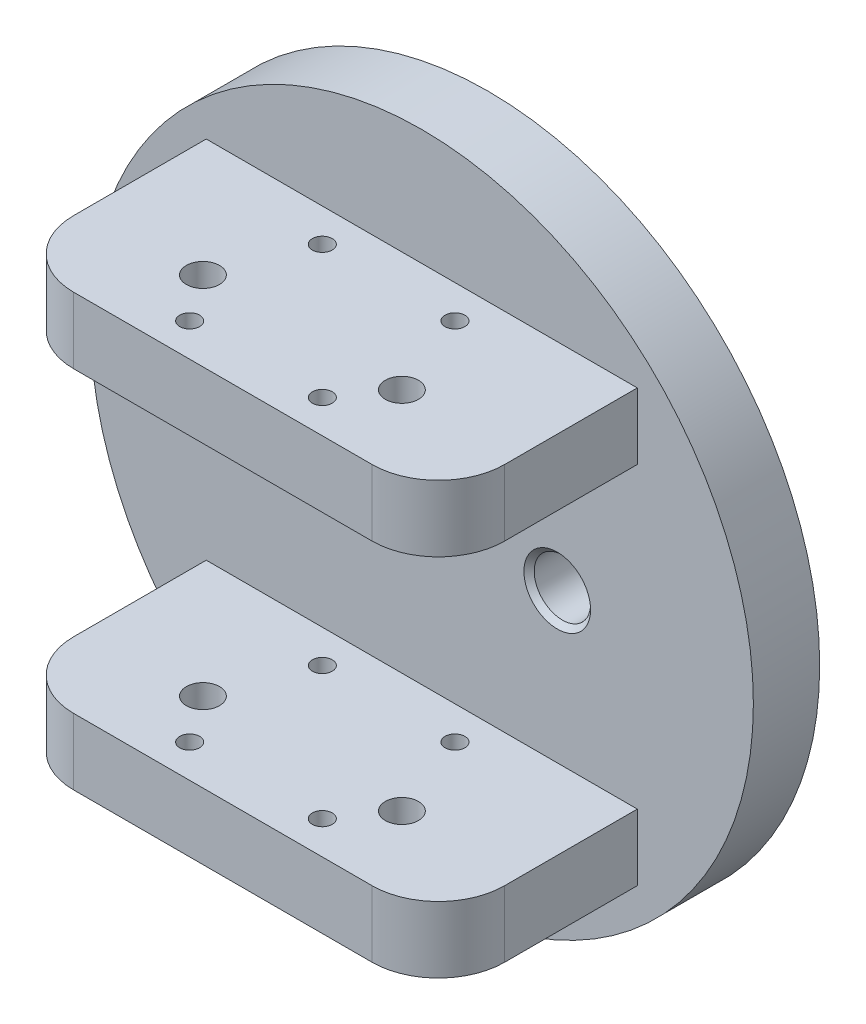
ISO-10303-21;
HEADER;
FILE_DESCRIPTION(('STEP AP214'),'2;1');
FILE_NAME('part.step','',(''),(''),'','','');
FILE_SCHEMA(('AUTOMOTIVE_DESIGN { 1 0 10303 214 1 1 1 1 }'));
ENDSEC;
DATA;
#1=APPLICATION_CONTEXT('core data for automotive mechanical design processes');
#2=APPLICATION_PROTOCOL_DEFINITION('international standard','automotive_design',2000,#1);
#3=PRODUCT_CONTEXT('',#1,'mechanical');
#4=PRODUCT('Part','Part','',(#3));
#5=PRODUCT_RELATED_PRODUCT_CATEGORY('part','',(#4));
#6=PRODUCT_DEFINITION_FORMATION('','',#4);
#7=PRODUCT_DEFINITION_CONTEXT('part definition',#1,'design');
#8=PRODUCT_DEFINITION('design','',#6,#7);
#9=PRODUCT_DEFINITION_SHAPE('','',#8);
#10=(LENGTH_UNIT() NAMED_UNIT(*) SI_UNIT(.MILLI.,.METRE.));
#11=(NAMED_UNIT(*) PLANE_ANGLE_UNIT() SI_UNIT($,.RADIAN.));
#12=(NAMED_UNIT(*) SI_UNIT($,.STERADIAN.) SOLID_ANGLE_UNIT());
#13=UNCERTAINTY_MEASURE_WITH_UNIT(LENGTH_MEASURE(1.E-05),#10,'distance_accuracy_value','');
#14=(GEOMETRIC_REPRESENTATION_CONTEXT(3) GLOBAL_UNCERTAINTY_ASSIGNED_CONTEXT((#13)) GLOBAL_UNIT_ASSIGNED_CONTEXT((#10,
#11,#12)) REPRESENTATION_CONTEXT('',''));
#15=CARTESIAN_POINT('',(0.,0.,0.));
#16=DIRECTION('',(0.,0.,1.));
#17=DIRECTION('',(1.,0.,0.));
#18=AXIS2_PLACEMENT_3D('',#15,#16,#17);
#19=CARTESIAN_POINT('',(-32.5,-22.5,40.));
#20=DIRECTION('',(0.,-1.,0.));
#21=DIRECTION('',(0.,0.,-1.));
#22=AXIS2_PLACEMENT_3D('',#19,#20,#21);
#23=PLANE('',#22);
#24=CARTESIAN_POINT('',(-15.,-22.5,28.));
#25=DIRECTION('',(0.,-1.,0.));
#26=DIRECTION('',(0.,0.,-1.));
#27=AXIS2_PLACEMENT_3D('',#24,#25,#26);
#28=CIRCLE('',#27,2.5);
#29=CARTESIAN_POINT('',(-15.,-22.5,25.5));
#30=VERTEX_POINT('',#29);
#31=EDGE_CURVE('E150',#30,#30,#28,.T.);
#32=ORIENTED_EDGE('',*,*,#31,.T.);
#33=EDGE_LOOP('',(#32));
#34=FACE_BOUND('',#33,.T.);
#35=CARTESIAN_POINT('',(-10.,-22.5,35.));
#36=DIRECTION('',(0.,-1.,0.));
#37=DIRECTION('',(0.,0.,-1.));
#38=AXIS2_PLACEMENT_3D('',#35,#36,#37);
#39=CIRCLE('',#38,1.5);
#40=CARTESIAN_POINT('',(-10.,-22.5,33.5));
#41=VERTEX_POINT('',#40);
#42=EDGE_CURVE('E404',#41,#41,#39,.T.);
#43=ORIENTED_EDGE('',*,*,#42,.T.);
#44=EDGE_LOOP('',(#43));
#45=FACE_BOUND('',#44,.T.);
#46=CARTESIAN_POINT('',(-10.,-22.5,15.));
#47=DIRECTION('',(0.,-1.,0.));
#48=DIRECTION('',(0.,0.,-1.));
#49=AXIS2_PLACEMENT_3D('',#46,#47,#48);
#50=CIRCLE('',#49,1.5);
#51=CARTESIAN_POINT('',(-10.,-22.5,13.5));
#52=VERTEX_POINT('',#51);
#53=EDGE_CURVE('E364',#52,#52,#50,.T.);
#54=ORIENTED_EDGE('',*,*,#53,.T.);
#55=EDGE_LOOP('',(#54));
#56=FACE_BOUND('',#55,.T.);
#57=DIRECTION('',(-1.,0.,0.));
#58=VECTOR('',#57,1.);
#59=CARTESIAN_POINT('',(-32.5,-22.5,40.));
#60=LINE('',#59,#58);
#61=CARTESIAN_POINT('',(22.5,-22.5,40.));
#62=VERTEX_POINT('',#61);
#63=CARTESIAN_POINT('',(-22.5,-22.5,40.));
#64=VERTEX_POINT('',#63);
#65=EDGE_CURVE('E167',#62,#64,#60,.T.);
#66=ORIENTED_EDGE('',*,*,#65,.F.);
#67=CARTESIAN_POINT('',(22.5,-22.5,30.));
#68=DIRECTION('',(0.,-1.,0.));
#69=DIRECTION('',(0.,0.,-1.));
#70=AXIS2_PLACEMENT_3D('',#67,#68,#69);
#71=CIRCLE('',#70,10.);
#72=CARTESIAN_POINT('',(32.5,-22.5,30.));
#73=VERTEX_POINT('',#72);
#74=EDGE_CURVE('E241',#62,#73,#71,.F.);
#75=ORIENTED_EDGE('',*,*,#74,.T.);
#76=DIRECTION('',(0.,0.,-1.));
#77=VECTOR('',#76,1.);
#78=CARTESIAN_POINT('',(32.5,-22.5,40.));
#79=LINE('',#78,#77);
#80=CARTESIAN_POINT('',(32.5,-22.5,10.));
#81=VERTEX_POINT('',#80);
#82=EDGE_CURVE('E190',#73,#81,#79,.T.);
#83=ORIENTED_EDGE('',*,*,#82,.T.);
#84=DIRECTION('',(-1.,0.,0.));
#85=VECTOR('',#84,1.);
#86=CARTESIAN_POINT('',(-32.5,-22.5,10.));
#87=LINE('',#86,#85);
#88=CARTESIAN_POINT('',(-32.5,-22.5,10.));
#89=VERTEX_POINT('',#88);
#90=EDGE_CURVE('E177',#81,#89,#87,.T.);
#91=ORIENTED_EDGE('',*,*,#90,.T.);
#92=DIRECTION('',(0.,0.,-1.));
#93=VECTOR('',#92,1.);
#94=CARTESIAN_POINT('',(-32.5,-22.5,40.));
#95=LINE('',#94,#93);
#96=CARTESIAN_POINT('',(-32.5,-22.5,30.));
#97=VERTEX_POINT('',#96);
#98=EDGE_CURVE('E188',#97,#89,#95,.T.);
#99=ORIENTED_EDGE('',*,*,#98,.F.);
#100=CARTESIAN_POINT('',(-22.5,-22.5,30.));
#101=DIRECTION('',(0.,-1.,0.));
#102=DIRECTION('',(0.,0.,-1.));
#103=AXIS2_PLACEMENT_3D('',#100,#101,#102);
#104=CIRCLE('',#103,10.);
#105=EDGE_CURVE('E239',#97,#64,#104,.F.);
#106=ORIENTED_EDGE('',*,*,#105,.T.);
#107=EDGE_LOOP('',(#66,#75,#83,#91,#99,#106));
#108=FACE_BOUND('',#107,.T.);
#109=CARTESIAN_POINT('',(10.,-22.5,35.));
#110=DIRECTION('',(0.,-1.,0.));
#111=DIRECTION('',(0.,0.,-1.));
#112=AXIS2_PLACEMENT_3D('',#109,#110,#111);
#113=CIRCLE('',#112,1.5);
#114=CARTESIAN_POINT('',(10.,-22.5,33.5));
#115=VERTEX_POINT('',#114);
#116=EDGE_CURVE('E377',#115,#115,#113,.F.);
#117=ORIENTED_EDGE('',*,*,#116,.F.);
#118=EDGE_LOOP('',(#117));
#119=FACE_BOUND('',#118,.T.);
#120=CARTESIAN_POINT('',(15.,-22.5,28.));
#121=DIRECTION('',(0.,-1.,0.));
#122=DIRECTION('',(0.,0.,-1.));
#123=AXIS2_PLACEMENT_3D('',#120,#121,#122);
#124=CIRCLE('',#123,2.5);
#125=CARTESIAN_POINT('',(15.,-22.5,25.5));
#126=VERTEX_POINT('',#125);
#127=EDGE_CURVE('E386',#126,#126,#124,.F.);
#128=ORIENTED_EDGE('',*,*,#127,.F.);
#129=EDGE_LOOP('',(#128));
#130=FACE_BOUND('',#129,.T.);
#131=CARTESIAN_POINT('',(10.,-22.5,15.));
#132=DIRECTION('',(0.,-1.,0.));
#133=DIRECTION('',(0.,0.,-1.));
#134=AXIS2_PLACEMENT_3D('',#131,#132,#133);
#135=CIRCLE('',#134,1.5);
#136=CARTESIAN_POINT('',(10.,-22.5,13.5));
#137=VERTEX_POINT('',#136);
#138=EDGE_CURVE('E395',#137,#137,#135,.F.);
#139=ORIENTED_EDGE('',*,*,#138,.F.);
#140=EDGE_LOOP('',(#139));
#141=FACE_BOUND('',#140,.T.);
#142=ADVANCED_FACE('F38',(#34,#45,#56,#108,#119,#130,#141),#23,.F.);
#143=CARTESIAN_POINT('',(-32.5,-32.5,40.));
#144=DIRECTION('',(0.,1.,0.));
#145=DIRECTION('',(0.,0.,1.));
#146=AXIS2_PLACEMENT_3D('',#143,#144,#145);
#147=PLANE('',#146);
#148=CARTESIAN_POINT('',(-15.,-32.5,28.));
#149=DIRECTION('',(0.,1.,0.));
#150=DIRECTION('',(0.,0.,1.));
#151=AXIS2_PLACEMENT_3D('',#148,#149,#150);
#152=CIRCLE('',#151,2.5);
#153=CARTESIAN_POINT('',(-15.,-32.5,30.5));
#154=VERTEX_POINT('',#153);
#155=EDGE_CURVE('E410',#154,#154,#152,.T.);
#156=ORIENTED_EDGE('',*,*,#155,.T.);
#157=EDGE_LOOP('',(#156));
#158=FACE_BOUND('',#157,.T.);
#159=CARTESIAN_POINT('',(-10.,-32.5,35.));
#160=DIRECTION('',(0.,1.,0.));
#161=DIRECTION('',(0.,0.,1.));
#162=AXIS2_PLACEMENT_3D('',#159,#160,#161);
#163=CIRCLE('',#162,1.5);
#164=CARTESIAN_POINT('',(-10.,-32.5,36.5));
#165=VERTEX_POINT('',#164);
#166=EDGE_CURVE('E401',#165,#165,#163,.T.);
#167=ORIENTED_EDGE('',*,*,#166,.T.);
#168=EDGE_LOOP('',(#167));
#169=FACE_BOUND('',#168,.T.);
#170=CARTESIAN_POINT('',(-10.,-32.5,15.));
#171=DIRECTION('',(0.,1.,0.));
#172=DIRECTION('',(0.,0.,1.));
#173=AXIS2_PLACEMENT_3D('',#170,#171,#172);
#174=CIRCLE('',#173,1.5);
#175=CARTESIAN_POINT('',(-10.,-32.5,16.5));
#176=VERTEX_POINT('',#175);
#177=EDGE_CURVE('E361',#176,#176,#174,.T.);
#178=ORIENTED_EDGE('',*,*,#177,.T.);
#179=EDGE_LOOP('',(#178));
#180=FACE_BOUND('',#179,.T.);
#181=DIRECTION('',(0.,0.,-1.));
#182=VECTOR('',#181,1.);
#183=CARTESIAN_POINT('',(32.5,-32.5,40.));
#184=LINE('',#183,#182);
#185=CARTESIAN_POINT('',(32.5,-32.5,30.));
#186=VERTEX_POINT('',#185);
#187=CARTESIAN_POINT('',(32.5,-32.5,10.));
#188=VERTEX_POINT('',#187);
#189=EDGE_CURVE('E174',#186,#188,#184,.T.);
#190=ORIENTED_EDGE('',*,*,#189,.F.);
#191=CARTESIAN_POINT('',(22.5,-32.5,30.));
#192=DIRECTION('',(0.,1.,0.));
#193=DIRECTION('',(0.,0.,1.));
#194=AXIS2_PLACEMENT_3D('',#191,#192,#193);
#195=CIRCLE('',#194,10.);
#196=CARTESIAN_POINT('',(22.5,-32.5,40.));
#197=VERTEX_POINT('',#196);
#198=EDGE_CURVE('E46',#186,#197,#195,.F.);
#199=ORIENTED_EDGE('',*,*,#198,.T.);
#200=DIRECTION('',(1.,0.,0.));
#201=VECTOR('',#200,1.);
#202=CARTESIAN_POINT('',(-32.5,-32.5,40.));
#203=LINE('',#202,#201);
#204=CARTESIAN_POINT('',(-22.5,-32.5,40.));
#205=VERTEX_POINT('',#204);
#206=EDGE_CURVE('E170',#205,#197,#203,.T.);
#207=ORIENTED_EDGE('',*,*,#206,.F.);
#208=CARTESIAN_POINT('',(-22.5,-32.5,30.));
#209=DIRECTION('',(0.,1.,0.));
#210=DIRECTION('',(0.,0.,1.));
#211=AXIS2_PLACEMENT_3D('',#208,#209,#210);
#212=CIRCLE('',#211,10.);
#213=CARTESIAN_POINT('',(-32.5,-32.5,30.));
#214=VERTEX_POINT('',#213);
#215=EDGE_CURVE('E53',#205,#214,#212,.F.);
#216=ORIENTED_EDGE('',*,*,#215,.T.);
#217=DIRECTION('',(0.,0.,-1.));
#218=VECTOR('',#217,1.);
#219=CARTESIAN_POINT('',(-32.5,-32.5,40.));
#220=LINE('',#219,#218);
#221=CARTESIAN_POINT('',(-32.5,-32.5,10.));
#222=VERTEX_POINT('',#221);
#223=EDGE_CURVE('E186',#214,#222,#220,.T.);
#224=ORIENTED_EDGE('',*,*,#223,.T.);
#225=DIRECTION('',(1.,0.,0.));
#226=VECTOR('',#225,1.);
#227=CARTESIAN_POINT('',(-32.5,-32.5,10.));
#228=LINE('',#227,#226);
#229=EDGE_CURVE('E171',#222,#188,#228,.T.);
#230=ORIENTED_EDGE('',*,*,#229,.T.);
#231=EDGE_LOOP('',(#190,#199,#207,#216,#224,#230));
#232=FACE_BOUND('',#231,.T.);
#233=CARTESIAN_POINT('',(10.,-32.5,35.));
#234=DIRECTION('',(0.,1.,0.));
#235=DIRECTION('',(0.,0.,1.));
#236=AXIS2_PLACEMENT_3D('',#233,#234,#235);
#237=CIRCLE('',#236,1.5);
#238=CARTESIAN_POINT('',(10.,-32.5,36.5));
#239=VERTEX_POINT('',#238);
#240=EDGE_CURVE('E369',#239,#239,#237,.F.);
#241=ORIENTED_EDGE('',*,*,#240,.F.);
#242=EDGE_LOOP('',(#241));
#243=FACE_BOUND('',#242,.T.);
#244=CARTESIAN_POINT('',(15.,-32.5,28.));
#245=DIRECTION('',(0.,1.,0.));
#246=DIRECTION('',(0.,0.,1.));
#247=AXIS2_PLACEMENT_3D('',#244,#245,#246);
#248=CIRCLE('',#247,2.5);
#249=CARTESIAN_POINT('',(15.,-32.5,30.5));
#250=VERTEX_POINT('',#249);
#251=EDGE_CURVE('E383',#250,#250,#248,.F.);
#252=ORIENTED_EDGE('',*,*,#251,.F.);
#253=EDGE_LOOP('',(#252));
#254=FACE_BOUND('',#253,.T.);
#255=CARTESIAN_POINT('',(10.,-32.5,15.));
#256=DIRECTION('',(0.,1.,0.));
#257=DIRECTION('',(0.,0.,1.));
#258=AXIS2_PLACEMENT_3D('',#255,#256,#257);
#259=CIRCLE('',#258,1.5);
#260=CARTESIAN_POINT('',(10.,-32.5,16.5));
#261=VERTEX_POINT('',#260);
#262=EDGE_CURVE('E392',#261,#261,#259,.F.);
#263=ORIENTED_EDGE('',*,*,#262,.F.);
#264=EDGE_LOOP('',(#263));
#265=FACE_BOUND('',#264,.T.);
#266=ADVANCED_FACE('F245',(#158,#169,#180,#232,#243,#254,#265),#147,.F.);
#267=CARTESIAN_POINT('',(-32.5,22.5,40.));
#268=DIRECTION('',(0.,1.,0.));
#269=DIRECTION('',(0.,0.,1.));
#270=AXIS2_PLACEMENT_3D('',#267,#268,#269);
#271=PLANE('',#270);
#272=CARTESIAN_POINT('',(-15.,22.5,28.));
#273=DIRECTION('',(0.,1.,0.));
#274=DIRECTION('',(0.,0.,1.));
#275=AXIS2_PLACEMENT_3D('',#272,#273,#274);
#276=CIRCLE('',#275,2.5);
#277=CARTESIAN_POINT('',(-15.,22.5,30.5));
#278=VERTEX_POINT('',#277);
#279=EDGE_CURVE('E407',#278,#278,#276,.T.);
#280=ORIENTED_EDGE('',*,*,#279,.T.);
#281=EDGE_LOOP('',(#280));
#282=FACE_BOUND('',#281,.T.);
#283=CARTESIAN_POINT('',(-10.,22.5,35.));
#284=DIRECTION('',(0.,1.,0.));
#285=DIRECTION('',(0.,0.,1.));
#286=AXIS2_PLACEMENT_3D('',#283,#284,#285);
#287=CIRCLE('',#286,1.5);
#288=CARTESIAN_POINT('',(-10.,22.5,36.5));
#289=VERTEX_POINT('',#288);
#290=EDGE_CURVE('E398',#289,#289,#287,.T.);
#291=ORIENTED_EDGE('',*,*,#290,.T.);
#292=EDGE_LOOP('',(#291));
#293=FACE_BOUND('',#292,.T.);
#294=CARTESIAN_POINT('',(-10.,22.5,15.));
#295=DIRECTION('',(0.,1.,0.));
#296=DIRECTION('',(0.,0.,1.));
#297=AXIS2_PLACEMENT_3D('',#294,#295,#296);
#298=CIRCLE('',#297,1.5);
#299=CARTESIAN_POINT('',(-10.,22.5,16.5));
#300=VERTEX_POINT('',#299);
#301=EDGE_CURVE('E371',#300,#300,#298,.T.);
#302=ORIENTED_EDGE('',*,*,#301,.T.);
#303=EDGE_LOOP('',(#302));
#304=FACE_BOUND('',#303,.T.);
#305=DIRECTION('',(0.,0.,-1.));
#306=VECTOR('',#305,1.);
#307=CARTESIAN_POINT('',(32.5,22.5,40.));
#308=LINE('',#307,#306);
#309=CARTESIAN_POINT('',(32.5,22.5,30.));
#310=VERTEX_POINT('',#309);
#311=CARTESIAN_POINT('',(32.5,22.5,10.));
#312=VERTEX_POINT('',#311);
#313=EDGE_CURVE('E140',#310,#312,#308,.T.);
#314=ORIENTED_EDGE('',*,*,#313,.F.);
#315=CARTESIAN_POINT('',(22.5,22.5,30.));
#316=DIRECTION('',(0.,1.,0.));
#317=DIRECTION('',(0.,0.,1.));
#318=AXIS2_PLACEMENT_3D('',#315,#316,#317);
#319=CIRCLE('',#318,10.);
#320=CARTESIAN_POINT('',(22.5,22.5,40.));
#321=VERTEX_POINT('',#320);
#322=EDGE_CURVE('E229',#310,#321,#319,.F.);
#323=ORIENTED_EDGE('',*,*,#322,.T.);
#324=DIRECTION('',(1.,0.,0.));
#325=VECTOR('',#324,1.);
#326=CARTESIAN_POINT('',(-32.5,22.5,40.));
#327=LINE('',#326,#325);
#328=CARTESIAN_POINT('',(-22.5,22.5,40.));
#329=VERTEX_POINT('',#328);
#330=EDGE_CURVE('E161',#329,#321,#327,.T.);
#331=ORIENTED_EDGE('',*,*,#330,.F.);
#332=CARTESIAN_POINT('',(-22.5,22.5,30.));
#333=DIRECTION('',(0.,1.,0.));
#334=DIRECTION('',(0.,0.,1.));
#335=AXIS2_PLACEMENT_3D('',#332,#333,#334);
#336=CIRCLE('',#335,10.);
#337=CARTESIAN_POINT('',(-32.5,22.5,30.));
#338=VERTEX_POINT('',#337);
#339=EDGE_CURVE('E136',#329,#338,#336,.F.);
#340=ORIENTED_EDGE('',*,*,#339,.T.);
#341=DIRECTION('',(0.,0.,-1.));
#342=VECTOR('',#341,1.);
#343=CARTESIAN_POINT('',(-32.5,22.5,40.));
#344=LINE('',#343,#342);
#345=CARTESIAN_POINT('',(-32.5,22.5,10.));
#346=VERTEX_POINT('',#345);
#347=EDGE_CURVE('E127',#338,#346,#344,.T.);
#348=ORIENTED_EDGE('',*,*,#347,.T.);
#349=DIRECTION('',(1.,0.,0.));
#350=VECTOR('',#349,1.);
#351=CARTESIAN_POINT('',(-32.5,22.5,10.));
#352=LINE('',#351,#350);
#353=EDGE_CURVE('E133',#346,#312,#352,.T.);
#354=ORIENTED_EDGE('',*,*,#353,.T.);
#355=EDGE_LOOP('',(#314,#323,#331,#340,#348,#354));
#356=FACE_BOUND('',#355,.T.);
#357=CARTESIAN_POINT('',(10.,22.5,35.));
#358=DIRECTION('',(0.,1.,0.));
#359=DIRECTION('',(0.,0.,1.));
#360=AXIS2_PLACEMENT_3D('',#357,#358,#359);
#361=CIRCLE('',#360,1.5);
#362=CARTESIAN_POINT('',(10.,22.5,36.5));
#363=VERTEX_POINT('',#362);
#364=EDGE_CURVE('E366',#363,#363,#361,.F.);
#365=ORIENTED_EDGE('',*,*,#364,.F.);
#366=EDGE_LOOP('',(#365));
#367=FACE_BOUND('',#366,.T.);
#368=CARTESIAN_POINT('',(15.,22.5,28.));
#369=DIRECTION('',(0.,1.,0.));
#370=DIRECTION('',(0.,0.,1.));
#371=AXIS2_PLACEMENT_3D('',#368,#369,#370);
#372=CIRCLE('',#371,2.5);
#373=CARTESIAN_POINT('',(15.,22.5,30.5));
#374=VERTEX_POINT('',#373);
#375=EDGE_CURVE('E380',#374,#374,#372,.F.);
#376=ORIENTED_EDGE('',*,*,#375,.F.);
#377=EDGE_LOOP('',(#376));
#378=FACE_BOUND('',#377,.T.);
#379=CARTESIAN_POINT('',(10.,22.5,15.));
#380=DIRECTION('',(0.,1.,0.));
#381=DIRECTION('',(0.,0.,1.));
#382=AXIS2_PLACEMENT_3D('',#379,#380,#381);
#383=CIRCLE('',#382,1.5);
#384=CARTESIAN_POINT('',(10.,22.5,16.5));
#385=VERTEX_POINT('',#384);
#386=EDGE_CURVE('E389',#385,#385,#383,.F.);
#387=ORIENTED_EDGE('',*,*,#386,.F.);
#388=EDGE_LOOP('',(#387));
#389=FACE_BOUND('',#388,.T.);
#390=ADVANCED_FACE('F130',(#282,#293,#304,#356,#367,#378,#389),#271,.F.);
#391=CARTESIAN_POINT('',(-32.5,32.5,40.));
#392=DIRECTION('',(0.,-1.,0.));
#393=DIRECTION('',(0.,0.,-1.));
#394=AXIS2_PLACEMENT_3D('',#391,#392,#393);
#395=PLANE('',#394);
#396=CARTESIAN_POINT('',(-15.,32.5,28.));
#397=DIRECTION('',(0.,1.,0.));
#398=DIRECTION('',(0.,0.,1.));
#399=AXIS2_PLACEMENT_3D('',#396,#397,#398);
#400=CIRCLE('',#399,2.5);
#401=CARTESIAN_POINT('',(-15.,32.5,30.5));
#402=VERTEX_POINT('',#401);
#403=EDGE_CURVE('E450',#402,#402,#400,.T.);
#404=ORIENTED_EDGE('',*,*,#403,.F.);
#405=EDGE_LOOP('',(#404));
#406=FACE_BOUND('',#405,.T.);
#407=CARTESIAN_POINT('',(-10.,32.5,35.));
#408=DIRECTION('',(0.,1.,0.));
#409=DIRECTION('',(0.,0.,1.));
#410=AXIS2_PLACEMENT_3D('',#407,#408,#409);
#411=CIRCLE('',#410,1.5);
#412=CARTESIAN_POINT('',(-10.,32.5,36.5));
#413=VERTEX_POINT('',#412);
#414=EDGE_CURVE('E463',#413,#413,#411,.T.);
#415=ORIENTED_EDGE('',*,*,#414,.F.);
#416=EDGE_LOOP('',(#415));
#417=FACE_BOUND('',#416,.T.);
#418=CARTESIAN_POINT('',(-10.,32.5,15.));
#419=DIRECTION('',(0.,1.,0.));
#420=DIRECTION('',(0.,0.,1.));
#421=AXIS2_PLACEMENT_3D('',#418,#419,#420);
#422=CIRCLE('',#421,1.5);
#423=CARTESIAN_POINT('',(-10.,32.5,16.5));
#424=VERTEX_POINT('',#423);
#425=EDGE_CURVE('E461',#424,#424,#422,.T.);
#426=ORIENTED_EDGE('',*,*,#425,.F.);
#427=EDGE_LOOP('',(#426));
#428=FACE_BOUND('',#427,.T.);
#429=DIRECTION('',(-1.,0.,0.));
#430=VECTOR('',#429,1.);
#431=CARTESIAN_POINT('',(-32.5,32.5,40.));
#432=LINE('',#431,#430);
#433=CARTESIAN_POINT('',(22.5,32.5,40.));
#434=VERTEX_POINT('',#433);
#435=CARTESIAN_POINT('',(-22.5,32.5,40.));
#436=VERTEX_POINT('',#435);
#437=EDGE_CURVE('E164',#434,#436,#432,.T.);
#438=ORIENTED_EDGE('',*,*,#437,.F.);
#439=CARTESIAN_POINT('',(22.5,32.5,30.));
#440=DIRECTION('',(0.,-1.,0.));
#441=DIRECTION('',(0.,0.,-1.));
#442=AXIS2_PLACEMENT_3D('',#439,#440,#441);
#443=CIRCLE('',#442,10.);
#444=CARTESIAN_POINT('',(32.5,32.5,30.));
#445=VERTEX_POINT('',#444);
#446=EDGE_CURVE('E224',#434,#445,#443,.F.);
#447=ORIENTED_EDGE('',*,*,#446,.T.);
#448=DIRECTION('',(0.,0.,-1.));
#449=VECTOR('',#448,1.);
#450=CARTESIAN_POINT('',(32.5,32.5,40.));
#451=LINE('',#450,#449);
#452=CARTESIAN_POINT('',(32.5,32.5,10.));
#453=VERTEX_POINT('',#452);
#454=EDGE_CURVE('E163',#445,#453,#451,.T.);
#455=ORIENTED_EDGE('',*,*,#454,.T.);
#456=DIRECTION('',(-1.,0.,0.));
#457=VECTOR('',#456,1.);
#458=CARTESIAN_POINT('',(-32.5,32.5,10.));
#459=LINE('',#458,#457);
#460=CARTESIAN_POINT('',(-32.5,32.5,10.));
#461=VERTEX_POINT('',#460);
#462=EDGE_CURVE('E156',#453,#461,#459,.T.);
#463=ORIENTED_EDGE('',*,*,#462,.T.);
#464=DIRECTION('',(0.,0.,-1.));
#465=VECTOR('',#464,1.);
#466=CARTESIAN_POINT('',(-32.5,32.5,40.));
#467=LINE('',#466,#465);
#468=CARTESIAN_POINT('',(-32.5,32.5,30.));
#469=VERTEX_POINT('',#468);
#470=EDGE_CURVE('E146',#469,#461,#467,.T.);
#471=ORIENTED_EDGE('',*,*,#470,.F.);
#472=CARTESIAN_POINT('',(-22.5,32.5,30.));
#473=DIRECTION('',(0.,-1.,0.));
#474=DIRECTION('',(0.,0.,-1.));
#475=AXIS2_PLACEMENT_3D('',#472,#473,#474);
#476=CIRCLE('',#475,10.);
#477=EDGE_CURVE('E222',#469,#436,#476,.F.);
#478=ORIENTED_EDGE('',*,*,#477,.T.);
#479=EDGE_LOOP('',(#438,#447,#455,#463,#471,#478));
#480=FACE_BOUND('',#479,.T.);
#481=CARTESIAN_POINT('',(10.,32.5,35.));
#482=DIRECTION('',(0.,-1.,0.));
#483=DIRECTION('',(0.,0.,-1.));
#484=AXIS2_PLACEMENT_3D('',#481,#482,#483);
#485=CIRCLE('',#484,1.5);
#486=CARTESIAN_POINT('',(10.,32.5,33.5));
#487=VERTEX_POINT('',#486);
#488=EDGE_CURVE('E458',#487,#487,#485,.T.);
#489=ORIENTED_EDGE('',*,*,#488,.T.);
#490=EDGE_LOOP('',(#489));
#491=FACE_BOUND('',#490,.T.);
#492=CARTESIAN_POINT('',(15.,32.5,28.));
#493=DIRECTION('',(0.,-1.,0.));
#494=DIRECTION('',(0.,0.,-1.));
#495=AXIS2_PLACEMENT_3D('',#492,#493,#494);
#496=CIRCLE('',#495,2.5);
#497=CARTESIAN_POINT('',(15.,32.5,25.5));
#498=VERTEX_POINT('',#497);
#499=EDGE_CURVE('E455',#498,#498,#496,.T.);
#500=ORIENTED_EDGE('',*,*,#499,.T.);
#501=EDGE_LOOP('',(#500));
#502=FACE_BOUND('',#501,.T.);
#503=CARTESIAN_POINT('',(10.,32.5,15.));
#504=DIRECTION('',(0.,-1.,0.));
#505=DIRECTION('',(0.,0.,-1.));
#506=AXIS2_PLACEMENT_3D('',#503,#504,#505);
#507=CIRCLE('',#506,1.5);
#508=CARTESIAN_POINT('',(10.,32.5,13.5));
#509=VERTEX_POINT('',#508);
#510=EDGE_CURVE('E452',#509,#509,#507,.T.);
#511=ORIENTED_EDGE('',*,*,#510,.T.);
#512=EDGE_LOOP('',(#511));
#513=FACE_BOUND('',#512,.T.);
#514=ADVANCED_FACE('F308',(#406,#417,#428,#480,#491,#502,#513),#395,.F.);
#515=CARTESIAN_POINT('',(0.,0.,10.));
#516=DIRECTION('',(0.,0.,1.));
#517=DIRECTION('',(1.,0.,0.));
#518=AXIS2_PLACEMENT_3D('',#515,#516,#517);
#519=PLANE('',#518);
#520=CARTESIAN_POINT('',(20.4266717285162,0.,10.));
#521=DIRECTION('',(0.,0.,1.));
#522=DIRECTION('',(1.,0.,0.));
#523=AXIS2_PLACEMENT_3D('',#520,#521,#522);
#524=CIRCLE('',#523,5.025);
#525=CARTESIAN_POINT('',(25.4516717285162,0.,10.));
#526=VERTEX_POINT('',#525);
#527=EDGE_CURVE('E192',#526,#526,#524,.T.);
#528=ORIENTED_EDGE('',*,*,#527,.F.);
#529=EDGE_LOOP('',(#528));
#530=FACE_BOUND('',#529,.T.);
#531=CARTESIAN_POINT('',(-20.4266717285162,0.,10.));
#532=DIRECTION('',(0.,0.,1.));
#533=DIRECTION('',(1.,0.,0.));
#534=AXIS2_PLACEMENT_3D('',#531,#532,#533);
#535=CIRCLE('',#534,5.025);
#536=CARTESIAN_POINT('',(-15.4016717285162,0.,10.));
#537=VERTEX_POINT('',#536);
#538=EDGE_CURVE('E201',#537,#537,#535,.T.);
#539=ORIENTED_EDGE('',*,*,#538,.F.);
#540=EDGE_LOOP('',(#539));
#541=FACE_BOUND('',#540,.T.);
#542=CARTESIAN_POINT('',(0.,0.,10.));
#543=DIRECTION('',(0.,0.,1.));
#544=DIRECTION('',(1.,0.,0.));
#545=AXIS2_PLACEMENT_3D('',#542,#543,#544);
#546=CIRCLE('',#545,50.);
#547=CARTESIAN_POINT('',(50.,0.,10.));
#548=VERTEX_POINT('',#547);
#549=EDGE_CURVE('E211',#548,#548,#546,.T.);
#550=ORIENTED_EDGE('',*,*,#549,.T.);
#551=EDGE_LOOP('',(#550));
#552=FACE_BOUND('',#551,.T.);
#553=ORIENTED_EDGE('',*,*,#90,.F.);
#554=DIRECTION('',(0.,1.,0.));
#555=VECTOR('',#554,1.);
#556=CARTESIAN_POINT('',(32.5,-22.5,10.));
#557=LINE('',#556,#555);
#558=EDGE_CURVE('E139',#188,#81,#557,.T.);
#559=ORIENTED_EDGE('',*,*,#558,.F.);
#560=ORIENTED_EDGE('',*,*,#229,.F.);
#561=DIRECTION('',(0.,-1.,0.));
#562=VECTOR('',#561,1.);
#563=CARTESIAN_POINT('',(-32.5,-22.5,10.));
#564=LINE('',#563,#562);
#565=EDGE_CURVE('E180',#89,#222,#564,.T.);
#566=ORIENTED_EDGE('',*,*,#565,.F.);
#567=EDGE_LOOP('',(#553,#559,#560,#566));
#568=FACE_BOUND('',#567,.T.);
#569=ORIENTED_EDGE('',*,*,#353,.F.);
#570=DIRECTION('',(0.,-1.,0.));
#571=VECTOR('',#570,1.);
#572=CARTESIAN_POINT('',(-32.5,32.5,10.));
#573=LINE('',#572,#571);
#574=EDGE_CURVE('E143',#461,#346,#573,.T.);
#575=ORIENTED_EDGE('',*,*,#574,.F.);
#576=ORIENTED_EDGE('',*,*,#462,.F.);
#577=DIRECTION('',(0.,1.,0.));
#578=VECTOR('',#577,1.);
#579=CARTESIAN_POINT('',(32.5,32.5,10.));
#580=LINE('',#579,#578);
#581=EDGE_CURVE('E154',#312,#453,#580,.T.);
#582=ORIENTED_EDGE('',*,*,#581,.F.);
#583=EDGE_LOOP('',(#569,#575,#576,#582));
#584=FACE_BOUND('',#583,.T.);
#585=ADVANCED_FACE('F152',(#530,#541,#552,#568,#584),#519,.T.);
#586=CARTESIAN_POINT('',(0.,0.,10.));
#587=DIRECTION('',(0.,0.,-1.));
#588=DIRECTION('',(-1.,0.,0.));
#589=AXIS2_PLACEMENT_3D('',#586,#587,#588);
#590=CYLINDRICAL_SURFACE('',#589,50.);
#591=ORIENTED_EDGE('',*,*,#549,.F.);
#592=EDGE_LOOP('',(#591));
#593=FACE_BOUND('',#592,.T.);
#594=CARTESIAN_POINT('',(0.,0.,0.));
#595=DIRECTION('',(0.,0.,1.));
#596=DIRECTION('',(1.,0.,0.));
#597=AXIS2_PLACEMENT_3D('',#594,#595,#596);
#598=CIRCLE('',#597,50.);
#599=CARTESIAN_POINT('',(50.,0.,0.));
#600=VERTEX_POINT('',#599);
#601=EDGE_CURVE('E210',#600,#600,#598,.T.);
#602=ORIENTED_EDGE('',*,*,#601,.T.);
#603=EDGE_LOOP('',(#602));
#604=FACE_BOUND('',#603,.T.);
#605=ADVANCED_FACE('F307',(#593,#604),#590,.T.);
#606=CARTESIAN_POINT('',(0.,0.,0.));
#607=DIRECTION('',(0.,0.,1.));
#608=DIRECTION('',(1.,0.,0.));
#609=AXIS2_PLACEMENT_3D('',#606,#607,#608);
#610=PLANE('',#609);
#611=CARTESIAN_POINT('',(20.4266717285162,0.,0.));
#612=DIRECTION('',(0.,0.,1.));
#613=DIRECTION('',(1.,0.,0.));
#614=AXIS2_PLACEMENT_3D('',#611,#612,#613);
#615=CIRCLE('',#614,4.25);
#616=CARTESIAN_POINT('',(24.6766717285162,0.,0.));
#617=VERTEX_POINT('',#616);
#618=EDGE_CURVE('E198',#617,#617,#615,.T.);
#619=ORIENTED_EDGE('',*,*,#618,.T.);
#620=EDGE_LOOP('',(#619));
#621=FACE_BOUND('',#620,.T.);
#622=CARTESIAN_POINT('',(-20.4266717285162,0.,0.));
#623=DIRECTION('',(0.,0.,1.));
#624=DIRECTION('',(1.,0.,0.));
#625=AXIS2_PLACEMENT_3D('',#622,#623,#624);
#626=CIRCLE('',#625,4.25);
#627=CARTESIAN_POINT('',(-16.1766717285162,0.,0.));
#628=VERTEX_POINT('',#627);
#629=EDGE_CURVE('E207',#628,#628,#626,.T.);
#630=ORIENTED_EDGE('',*,*,#629,.T.);
#631=EDGE_LOOP('',(#630));
#632=FACE_BOUND('',#631,.T.);
#633=ORIENTED_EDGE('',*,*,#601,.F.);
#634=EDGE_LOOP('',(#633));
#635=FACE_BOUND('',#634,.T.);
#636=ADVANCED_FACE('F303',(#621,#632,#635),#610,.F.);
#637=CARTESIAN_POINT('',(-20.4266717285162,0.,10.));
#638=DIRECTION('',(0.,0.,1.));
#639=DIRECTION('',(1.,0.,0.));
#640=AXIS2_PLACEMENT_3D('',#637,#638,#639);
#641=CYLINDRICAL_SURFACE('',#640,4.25);
#642=ORIENTED_EDGE('',*,*,#629,.F.);
#643=EDGE_LOOP('',(#642));
#644=FACE_BOUND('',#643,.T.);
#645=CARTESIAN_POINT('',(-20.4266717285162,0.,9.225));
#646=DIRECTION('',(0.,0.,1.));
#647=DIRECTION('',(1.,0.,0.));
#648=AXIS2_PLACEMENT_3D('',#645,#646,#647);
#649=CIRCLE('',#648,4.25);
#650=CARTESIAN_POINT('',(-16.1766717285162,0.,9.225));
#651=VERTEX_POINT('',#650);
#652=EDGE_CURVE('E204',#651,#651,#649,.T.);
#653=ORIENTED_EDGE('',*,*,#652,.T.);
#654=EDGE_LOOP('',(#653));
#655=FACE_BOUND('',#654,.T.);
#656=ADVANCED_FACE('F299',(#644,#655),#641,.F.);
#657=CARTESIAN_POINT('',(-20.4266717285162,0.,10.));
#658=DIRECTION('',(0.,0.,1.));
#659=DIRECTION('',(1.,0.,0.));
#660=AXIS2_PLACEMENT_3D('',#657,#658,#659);
#661=CONICAL_SURFACE('',#660,5.025,0.785398163397448);
#662=ORIENTED_EDGE('',*,*,#652,.F.);
#663=EDGE_LOOP('',(#662));
#664=FACE_BOUND('',#663,.T.);
#665=ORIENTED_EDGE('',*,*,#538,.T.);
#666=EDGE_LOOP('',(#665));
#667=FACE_BOUND('',#666,.T.);
#668=ADVANCED_FACE('F295',(#664,#667),#661,.F.);
#669=CARTESIAN_POINT('',(20.4266717285162,0.,10.));
#670=DIRECTION('',(0.,0.,1.));
#671=DIRECTION('',(1.,0.,0.));
#672=AXIS2_PLACEMENT_3D('',#669,#670,#671);
#673=CYLINDRICAL_SURFACE('',#672,4.25);
#674=ORIENTED_EDGE('',*,*,#618,.F.);
#675=EDGE_LOOP('',(#674));
#676=FACE_BOUND('',#675,.T.);
#677=CARTESIAN_POINT('',(20.4266717285162,0.,9.225));
#678=DIRECTION('',(0.,0.,1.));
#679=DIRECTION('',(1.,0.,0.));
#680=AXIS2_PLACEMENT_3D('',#677,#678,#679);
#681=CIRCLE('',#680,4.25);
#682=CARTESIAN_POINT('',(24.6766717285162,0.,9.225));
#683=VERTEX_POINT('',#682);
#684=EDGE_CURVE('E195',#683,#683,#681,.T.);
#685=ORIENTED_EDGE('',*,*,#684,.T.);
#686=EDGE_LOOP('',(#685));
#687=FACE_BOUND('',#686,.T.);
#688=ADVANCED_FACE('F291',(#676,#687),#673,.F.);
#689=CARTESIAN_POINT('',(20.4266717285162,0.,10.));
#690=DIRECTION('',(0.,0.,1.));
#691=DIRECTION('',(1.,0.,0.));
#692=AXIS2_PLACEMENT_3D('',#689,#690,#691);
#693=CONICAL_SURFACE('',#692,5.025,0.785398163397448);
#694=ORIENTED_EDGE('',*,*,#684,.F.);
#695=EDGE_LOOP('',(#694));
#696=FACE_BOUND('',#695,.T.);
#697=ORIENTED_EDGE('',*,*,#527,.T.);
#698=EDGE_LOOP('',(#697));
#699=FACE_BOUND('',#698,.T.);
#700=ADVANCED_FACE('F275',(#696,#699),#693,.F.);
#701=CARTESIAN_POINT('',(32.5,-22.5,40.));
#702=DIRECTION('',(-1.,0.,0.));
#703=DIRECTION('',(0.,-1.,0.));
#704=AXIS2_PLACEMENT_3D('',#701,#702,#703);
#705=PLANE('',#704);
#706=ORIENTED_EDGE('',*,*,#82,.F.);
#707=DIRECTION('',(0.,1.,0.));
#708=VECTOR('',#707,1.);
#709=CARTESIAN_POINT('',(32.5,-32.5,30.));
#710=LINE('',#709,#708);
#711=EDGE_CURVE('E61',#73,#186,#710,.F.);
#712=ORIENTED_EDGE('',*,*,#711,.T.);
#713=ORIENTED_EDGE('',*,*,#189,.T.);
#714=ORIENTED_EDGE('',*,*,#558,.T.);
#715=EDGE_LOOP('',(#706,#712,#713,#714));
#716=FACE_BOUND('',#715,.T.);
#717=ADVANCED_FACE('F256',(#716),#705,.F.);
#718=CARTESIAN_POINT('',(-32.5,-22.5,40.));
#719=DIRECTION('',(1.,0.,0.));
#720=DIRECTION('',(0.,1.,0.));
#721=AXIS2_PLACEMENT_3D('',#718,#719,#720);
#722=PLANE('',#721);
#723=ORIENTED_EDGE('',*,*,#223,.F.);
#724=DIRECTION('',(0.,-1.,0.));
#725=VECTOR('',#724,1.);
#726=CARTESIAN_POINT('',(-32.5,-22.5,30.));
#727=LINE('',#726,#725);
#728=EDGE_CURVE('E11',#214,#97,#727,.F.);
#729=ORIENTED_EDGE('',*,*,#728,.T.);
#730=ORIENTED_EDGE('',*,*,#98,.T.);
#731=ORIENTED_EDGE('',*,*,#565,.T.);
#732=EDGE_LOOP('',(#723,#729,#730,#731));
#733=FACE_BOUND('',#732,.T.);
#734=ADVANCED_FACE('F267',(#733),#722,.F.);
#735=CARTESIAN_POINT('',(0.,0.,40.));
#736=DIRECTION('',(0.,0.,1.));
#737=DIRECTION('',(1.,0.,0.));
#738=AXIS2_PLACEMENT_3D('',#735,#736,#737);
#739=PLANE('',#738);
#740=ORIENTED_EDGE('',*,*,#206,.T.);
#741=DIRECTION('',(0.,1.,0.));
#742=VECTOR('',#741,1.);
#743=CARTESIAN_POINT('',(22.5,-22.5,40.));
#744=LINE('',#743,#742);
#745=EDGE_CURVE('E236',#197,#62,#744,.T.);
#746=ORIENTED_EDGE('',*,*,#745,.T.);
#747=ORIENTED_EDGE('',*,*,#65,.T.);
#748=DIRECTION('',(0.,-1.,0.));
#749=VECTOR('',#748,1.);
#750=CARTESIAN_POINT('',(-22.5,-32.5,40.));
#751=LINE('',#750,#749);
#752=EDGE_CURVE('E233',#64,#205,#751,.T.);
#753=ORIENTED_EDGE('',*,*,#752,.T.);
#754=EDGE_LOOP('',(#740,#746,#747,#753));
#755=FACE_BOUND('',#754,.T.);
#756=ADVANCED_FACE('F250',(#755),#739,.T.);
#757=CARTESIAN_POINT('',(-32.5,32.5,40.));
#758=DIRECTION('',(1.,0.,0.));
#759=DIRECTION('',(0.,0.,-1.));
#760=AXIS2_PLACEMENT_3D('',#757,#758,#759);
#761=PLANE('',#760);
#762=ORIENTED_EDGE('',*,*,#347,.F.);
#763=DIRECTION('',(0.,-1.,0.));
#764=VECTOR('',#763,1.);
#765=CARTESIAN_POINT('',(-32.5,32.5,30.));
#766=LINE('',#765,#764);
#767=EDGE_CURVE('E231',#338,#469,#766,.F.);
#768=ORIENTED_EDGE('',*,*,#767,.T.);
#769=ORIENTED_EDGE('',*,*,#470,.T.);
#770=ORIENTED_EDGE('',*,*,#574,.T.);
#771=EDGE_LOOP('',(#762,#768,#769,#770));
#772=FACE_BOUND('',#771,.T.);
#773=ADVANCED_FACE('F144',(#772),#761,.F.);
#774=CARTESIAN_POINT('',(32.5,32.5,40.));
#775=DIRECTION('',(-1.,0.,0.));
#776=DIRECTION('',(0.,0.,1.));
#777=AXIS2_PLACEMENT_3D('',#774,#775,#776);
#778=PLANE('',#777);
#779=ORIENTED_EDGE('',*,*,#454,.F.);
#780=DIRECTION('',(0.,1.,0.));
#781=VECTOR('',#780,1.);
#782=CARTESIAN_POINT('',(32.5,22.5,30.));
#783=LINE('',#782,#781);
#784=EDGE_CURVE('E226',#445,#310,#783,.F.);
#785=ORIENTED_EDGE('',*,*,#784,.T.);
#786=ORIENTED_EDGE('',*,*,#313,.T.);
#787=ORIENTED_EDGE('',*,*,#581,.T.);
#788=EDGE_LOOP('',(#779,#785,#786,#787));
#789=FACE_BOUND('',#788,.T.);
#790=ADVANCED_FACE('F426',(#789),#778,.F.);
#791=CARTESIAN_POINT('',(0.,0.,40.));
#792=DIRECTION('',(0.,0.,1.));
#793=DIRECTION('',(1.,0.,0.));
#794=AXIS2_PLACEMENT_3D('',#791,#792,#793);
#795=PLANE('',#794);
#796=ORIENTED_EDGE('',*,*,#330,.T.);
#797=DIRECTION('',(0.,1.,0.));
#798=VECTOR('',#797,1.);
#799=CARTESIAN_POINT('',(22.5,32.5,40.));
#800=LINE('',#799,#798);
#801=EDGE_CURVE('E219',#321,#434,#800,.T.);
#802=ORIENTED_EDGE('',*,*,#801,.T.);
#803=ORIENTED_EDGE('',*,*,#437,.T.);
#804=DIRECTION('',(0.,-1.,0.));
#805=VECTOR('',#804,1.);
#806=CARTESIAN_POINT('',(-22.5,22.5,40.));
#807=LINE('',#806,#805);
#808=EDGE_CURVE('E214',#436,#329,#807,.T.);
#809=ORIENTED_EDGE('',*,*,#808,.T.);
#810=EDGE_LOOP('',(#796,#802,#803,#809));
#811=FACE_BOUND('',#810,.T.);
#812=ADVANCED_FACE('F320',(#811),#795,.T.);
#813=CARTESIAN_POINT('',(22.5,0.,30.));
#814=DIRECTION('',(0.,-1.,0.));
#815=DIRECTION('',(0.,0.,-1.));
#816=AXIS2_PLACEMENT_3D('',#813,#814,#815);
#817=CYLINDRICAL_SURFACE('',#816,10.);
#818=ORIENTED_EDGE('',*,*,#322,.F.);
#819=ORIENTED_EDGE('',*,*,#784,.F.);
#820=ORIENTED_EDGE('',*,*,#446,.F.);
#821=ORIENTED_EDGE('',*,*,#801,.F.);
#822=EDGE_LOOP('',(#818,#819,#820,#821));
#823=FACE_BOUND('',#822,.T.);
#824=ADVANCED_FACE('F316',(#823),#817,.T.);
#825=CARTESIAN_POINT('',(-22.5,0.,30.));
#826=DIRECTION('',(0.,1.,0.));
#827=DIRECTION('',(0.,0.,1.));
#828=AXIS2_PLACEMENT_3D('',#825,#826,#827);
#829=CYLINDRICAL_SURFACE('',#828,10.);
#830=ORIENTED_EDGE('',*,*,#477,.F.);
#831=ORIENTED_EDGE('',*,*,#767,.F.);
#832=ORIENTED_EDGE('',*,*,#339,.F.);
#833=ORIENTED_EDGE('',*,*,#808,.F.);
#834=EDGE_LOOP('',(#830,#831,#832,#833));
#835=FACE_BOUND('',#834,.T.);
#836=ADVANCED_FACE('F319',(#835),#829,.T.);
#837=CARTESIAN_POINT('',(22.5,0.,30.));
#838=DIRECTION('',(0.,-1.,0.));
#839=DIRECTION('',(1.,0.,0.));
#840=AXIS2_PLACEMENT_3D('',#837,#838,#839);
#841=CYLINDRICAL_SURFACE('',#840,10.);
#842=ORIENTED_EDGE('',*,*,#198,.F.);
#843=ORIENTED_EDGE('',*,*,#711,.F.);
#844=ORIENTED_EDGE('',*,*,#74,.F.);
#845=ORIENTED_EDGE('',*,*,#745,.F.);
#846=EDGE_LOOP('',(#842,#843,#844,#845));
#847=FACE_BOUND('',#846,.T.);
#848=ADVANCED_FACE('F253',(#847),#841,.T.);
#849=CARTESIAN_POINT('',(-22.5,0.,30.));
#850=DIRECTION('',(0.,1.,0.));
#851=DIRECTION('',(-1.,0.,0.));
#852=AXIS2_PLACEMENT_3D('',#849,#850,#851);
#853=CYLINDRICAL_SURFACE('',#852,10.);
#854=ORIENTED_EDGE('',*,*,#105,.F.);
#855=ORIENTED_EDGE('',*,*,#728,.F.);
#856=ORIENTED_EDGE('',*,*,#215,.F.);
#857=ORIENTED_EDGE('',*,*,#752,.F.);
#858=EDGE_LOOP('',(#854,#855,#856,#857));
#859=FACE_BOUND('',#858,.T.);
#860=ADVANCED_FACE('F40',(#859),#853,.T.);
#861=CARTESIAN_POINT('',(-10.,-50.,15.));
#862=DIRECTION('',(0.,1.,0.));
#863=DIRECTION('',(0.,0.,1.));
#864=AXIS2_PLACEMENT_3D('',#861,#862,#863);
#865=CYLINDRICAL_SURFACE('',#864,1.5);
#866=ORIENTED_EDGE('',*,*,#425,.T.);
#867=EDGE_LOOP('',(#866));
#868=FACE_BOUND('',#867,.T.);
#869=ORIENTED_EDGE('',*,*,#301,.F.);
#870=EDGE_LOOP('',(#869));
#871=FACE_BOUND('',#870,.T.);
#872=ADVANCED_FACE('F328',(#868,#871),#865,.F.);
#873=CARTESIAN_POINT('',(10.,-50.,35.));
#874=DIRECTION('',(0.,1.,0.));
#875=DIRECTION('',(0.,0.,1.));
#876=AXIS2_PLACEMENT_3D('',#873,#874,#875);
#877=CYLINDRICAL_SURFACE('',#876,1.5);
#878=ORIENTED_EDGE('',*,*,#488,.F.);
#879=EDGE_LOOP('',(#878));
#880=FACE_BOUND('',#879,.T.);
#881=ORIENTED_EDGE('',*,*,#364,.T.);
#882=EDGE_LOOP('',(#881));
#883=FACE_BOUND('',#882,.T.);
#884=ADVANCED_FACE('F331',(#880,#883),#877,.F.);
#885=CARTESIAN_POINT('',(15.,-50.,28.));
#886=DIRECTION('',(0.,1.,0.));
#887=DIRECTION('',(0.,0.,1.));
#888=AXIS2_PLACEMENT_3D('',#885,#886,#887);
#889=CYLINDRICAL_SURFACE('',#888,2.5);
#890=ORIENTED_EDGE('',*,*,#499,.F.);
#891=EDGE_LOOP('',(#890));
#892=FACE_BOUND('',#891,.T.);
#893=ORIENTED_EDGE('',*,*,#375,.T.);
#894=EDGE_LOOP('',(#893));
#895=FACE_BOUND('',#894,.T.);
#896=ADVANCED_FACE('F338',(#892,#895),#889,.F.);
#897=CARTESIAN_POINT('',(10.,-50.,15.));
#898=DIRECTION('',(0.,1.,0.));
#899=DIRECTION('',(0.,0.,1.));
#900=AXIS2_PLACEMENT_3D('',#897,#898,#899);
#901=CYLINDRICAL_SURFACE('',#900,1.5);
#902=ORIENTED_EDGE('',*,*,#510,.F.);
#903=EDGE_LOOP('',(#902));
#904=FACE_BOUND('',#903,.T.);
#905=ORIENTED_EDGE('',*,*,#386,.T.);
#906=EDGE_LOOP('',(#905));
#907=FACE_BOUND('',#906,.T.);
#908=ADVANCED_FACE('F474',(#904,#907),#901,.F.);
#909=CARTESIAN_POINT('',(-10.,-50.,35.));
#910=DIRECTION('',(0.,1.,0.));
#911=DIRECTION('',(0.,0.,1.));
#912=AXIS2_PLACEMENT_3D('',#909,#910,#911);
#913=CYLINDRICAL_SURFACE('',#912,1.5);
#914=ORIENTED_EDGE('',*,*,#414,.T.);
#915=EDGE_LOOP('',(#914));
#916=FACE_BOUND('',#915,.T.);
#917=ORIENTED_EDGE('',*,*,#290,.F.);
#918=EDGE_LOOP('',(#917));
#919=FACE_BOUND('',#918,.T.);
#920=ADVANCED_FACE('F354',(#916,#919),#913,.F.);
#921=CARTESIAN_POINT('',(-15.,-50.,28.));
#922=DIRECTION('',(0.,1.,0.));
#923=DIRECTION('',(0.,0.,1.));
#924=AXIS2_PLACEMENT_3D('',#921,#922,#923);
#925=CYLINDRICAL_SURFACE('',#924,2.5);
#926=ORIENTED_EDGE('',*,*,#403,.T.);
#927=EDGE_LOOP('',(#926));
#928=FACE_BOUND('',#927,.T.);
#929=ORIENTED_EDGE('',*,*,#279,.F.);
#930=EDGE_LOOP('',(#929));
#931=FACE_BOUND('',#930,.T.);
#932=ADVANCED_FACE('F346',(#928,#931),#925,.F.);
#933=ORIENTED_EDGE('',*,*,#177,.F.);
#934=EDGE_LOOP('',(#933));
#935=FACE_BOUND('',#934,.T.);
#936=ORIENTED_EDGE('',*,*,#53,.F.);
#937=EDGE_LOOP('',(#936));
#938=FACE_BOUND('',#937,.T.);
#939=ADVANCED_FACE('F334',(#935,#938),#865,.F.);
#940=ORIENTED_EDGE('',*,*,#240,.T.);
#941=EDGE_LOOP('',(#940));
#942=FACE_BOUND('',#941,.T.);
#943=ORIENTED_EDGE('',*,*,#116,.T.);
#944=EDGE_LOOP('',(#943));
#945=FACE_BOUND('',#944,.T.);
#946=ADVANCED_FACE('F341',(#942,#945),#877,.F.);
#947=ORIENTED_EDGE('',*,*,#251,.T.);
#948=EDGE_LOOP('',(#947));
#949=FACE_BOUND('',#948,.T.);
#950=ORIENTED_EDGE('',*,*,#127,.T.);
#951=EDGE_LOOP('',(#950));
#952=FACE_BOUND('',#951,.T.);
#953=ADVANCED_FACE('F352',(#949,#952),#889,.F.);
#954=ORIENTED_EDGE('',*,*,#262,.T.);
#955=EDGE_LOOP('',(#954));
#956=FACE_BOUND('',#955,.T.);
#957=ORIENTED_EDGE('',*,*,#138,.T.);
#958=EDGE_LOOP('',(#957));
#959=FACE_BOUND('',#958,.T.);
#960=ADVANCED_FACE('F481',(#956,#959),#901,.F.);
#961=ORIENTED_EDGE('',*,*,#166,.F.);
#962=EDGE_LOOP('',(#961));
#963=FACE_BOUND('',#962,.T.);
#964=ORIENTED_EDGE('',*,*,#42,.F.);
#965=EDGE_LOOP('',(#964));
#966=FACE_BOUND('',#965,.T.);
#967=ADVANCED_FACE('F476',(#963,#966),#913,.F.);
#968=ORIENTED_EDGE('',*,*,#155,.F.);
#969=EDGE_LOOP('',(#968));
#970=FACE_BOUND('',#969,.T.);
#971=ORIENTED_EDGE('',*,*,#31,.F.);
#972=EDGE_LOOP('',(#971));
#973=FACE_BOUND('',#972,.T.);
#974=ADVANCED_FACE('F357',(#970,#973),#925,.F.);
#975=CLOSED_SHELL('',(#142,#266,#390,#514,#585,#605,#636,#656,#668,#688,#700,#717,#734,#756,
#773,#790,#812,#824,#836,#848,#860,#872,#884,#896,#908,#920,#932,#939,#946,#953,#960,#967,#974));
#976=MANIFOLD_SOLID_BREP('B2',#975);
#977=ADVANCED_BREP_SHAPE_REPRESENTATION('',(#18,#976),#14);
#978=SHAPE_DEFINITION_REPRESENTATION(#9,#977);
ENDSEC;
END-ISO-10303-21;
